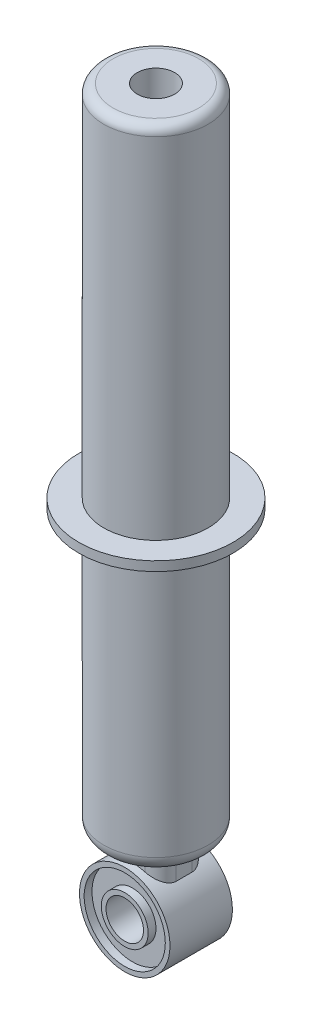
ISO-10303-21;
HEADER;
FILE_DESCRIPTION(('STEP AP214'),'2;1');
FILE_NAME('part.step','',(''),(''),'','','');
FILE_SCHEMA(('AUTOMOTIVE_DESIGN { 1 0 10303 214 1 1 1 1 }'));
ENDSEC;
DATA;
#1=APPLICATION_CONTEXT('core data for automotive mechanical design processes');
#2=APPLICATION_PROTOCOL_DEFINITION('international standard','automotive_design',2000,#1);
#3=PRODUCT_CONTEXT('',#1,'mechanical');
#4=PRODUCT('Part','Part','',(#3));
#5=PRODUCT_RELATED_PRODUCT_CATEGORY('part','',(#4));
#6=PRODUCT_DEFINITION_FORMATION('','',#4);
#7=PRODUCT_DEFINITION_CONTEXT('part definition',#1,'design');
#8=PRODUCT_DEFINITION('design','',#6,#7);
#9=PRODUCT_DEFINITION_SHAPE('','',#8);
#10=(LENGTH_UNIT() NAMED_UNIT(*) SI_UNIT(.MILLI.,.METRE.));
#11=(NAMED_UNIT(*) PLANE_ANGLE_UNIT() SI_UNIT($,.RADIAN.));
#12=(NAMED_UNIT(*) SI_UNIT($,.STERADIAN.) SOLID_ANGLE_UNIT());
#13=UNCERTAINTY_MEASURE_WITH_UNIT(LENGTH_MEASURE(1.E-05),#10,'distance_accuracy_value','');
#14=(GEOMETRIC_REPRESENTATION_CONTEXT(3) GLOBAL_UNCERTAINTY_ASSIGNED_CONTEXT((#13)) GLOBAL_UNIT_ASSIGNED_CONTEXT((#10,
#11,#12)) REPRESENTATION_CONTEXT('',''));
#15=CARTESIAN_POINT('',(0.,0.,0.));
#16=DIRECTION('',(0.,0.,1.));
#17=DIRECTION('',(1.,0.,0.));
#18=AXIS2_PLACEMENT_3D('',#15,#16,#17);
#19=CARTESIAN_POINT('',(0.,208.,0.));
#20=DIRECTION('',(0.,-1.,0.));
#21=DIRECTION('',(0.,0.,-1.));
#22=AXIS2_PLACEMENT_3D('',#19,#20,#21);
#23=CYLINDRICAL_SURFACE('',#22,16.7112299465241);
#24=CARTESIAN_POINT('',(0.,4.99999999999998,0.));
#25=DIRECTION('',(0.,1.,0.));
#26=DIRECTION('',(0.,0.,1.));
#27=AXIS2_PLACEMENT_3D('',#24,#25,#26);
#28=CIRCLE('',#27,16.7112299465241);
#29=CARTESIAN_POINT('',(0.,4.99999999999995,-16.7112299465241));
#30=VERTEX_POINT('',#29);
#31=EDGE_CURVE('E193',#30,#30,#28,.T.);
#32=CARTESIAN_POINT('',(0.,90.,0.));
#33=DIRECTION('',(0.,1.,0.));
#34=DIRECTION('',(0.,0.,1.));
#35=AXIS2_PLACEMENT_3D('',#32,#33,#34);
#36=CIRCLE('',#35,16.7112299465241);
#37=CARTESIAN_POINT('',(0.,90.,-16.7112299465241));
#38=VERTEX_POINT('',#37);
#39=EDGE_CURVE('E11',#38,#38,#36,.T.);
#40=CARTESIAN_POINT('',(0.,4.99999999999995,-16.7112299465241));
#41=CARTESIAN_POINT('',(0.,5.88541666666662,-16.7112299465241));
#42=CARTESIAN_POINT('',(0.,6.77083333333328,-16.7112299465241));
#43=CARTESIAN_POINT('',(0.,8.54166666666661,-16.7112299465241));
#44=CARTESIAN_POINT('',(0.,9.42708333333328,-16.7112299465241));
#45=CARTESIAN_POINT('',(0.,11.1979166666666,-16.7112299465241));
#46=CARTESIAN_POINT('',(0.,12.0833333333333,-16.7112299465241));
#47=CARTESIAN_POINT('',(0.,13.8541666666666,-16.7112299465241));
#48=CARTESIAN_POINT('',(0.,14.7395833333333,-16.7112299465241));
#49=CARTESIAN_POINT('',(0.,16.5104166666666,-16.7112299465241));
#50=CARTESIAN_POINT('',(0.,17.3958333333333,-16.7112299465241));
#51=CARTESIAN_POINT('',(0.,19.1666666666666,-16.7112299465241));
#52=CARTESIAN_POINT('',(0.,20.0520833333333,-16.7112299465241));
#53=CARTESIAN_POINT('',(0.,21.8229166666666,-16.7112299465241));
#54=CARTESIAN_POINT('',(0.,22.7083333333333,-16.7112299465241));
#55=CARTESIAN_POINT('',(0.,24.4791666666666,-16.7112299465241));
#56=CARTESIAN_POINT('',(0.,25.3645833333333,-16.7112299465241));
#57=CARTESIAN_POINT('',(0.,27.1354166666666,-16.7112299465241));
#58=CARTESIAN_POINT('',(0.,28.0208333333333,-16.7112299465241));
#59=CARTESIAN_POINT('',(0.,29.7916666666666,-16.7112299465241));
#60=CARTESIAN_POINT('',(0.,30.6770833333333,-16.7112299465241));
#61=CARTESIAN_POINT('',(0.,32.4479166666666,-16.7112299465241));
#62=CARTESIAN_POINT('',(0.,33.3333333333333,-16.7112299465241));
#63=CARTESIAN_POINT('',(0.,35.1041666666666,-16.7112299465241));
#64=CARTESIAN_POINT('',(0.,35.9895833333333,-16.7112299465241));
#65=CARTESIAN_POINT('',(0.,37.7604166666666,-16.7112299465241));
#66=CARTESIAN_POINT('',(0.,38.6458333333333,-16.7112299465241));
#67=CARTESIAN_POINT('',(0.,40.4166666666666,-16.7112299465241));
#68=CARTESIAN_POINT('',(0.,41.3020833333333,-16.7112299465241));
#69=CARTESIAN_POINT('',(0.,43.0729166666666,-16.7112299465241));
#70=CARTESIAN_POINT('',(0.,43.9583333333333,-16.7112299465241));
#71=CARTESIAN_POINT('',(0.,45.7291666666666,-16.7112299465241));
#72=CARTESIAN_POINT('',(0.,46.6145833333333,-16.7112299465241));
#73=CARTESIAN_POINT('',(0.,48.3854166666666,-16.7112299465241));
#74=CARTESIAN_POINT('',(0.,49.2708333333333,-16.7112299465241));
#75=CARTESIAN_POINT('',(0.,51.0416666666666,-16.7112299465241));
#76=CARTESIAN_POINT('',(0.,51.9270833333333,-16.7112299465241));
#77=CARTESIAN_POINT('',(0.,53.6979166666667,-16.7112299465241));
#78=CARTESIAN_POINT('',(0.,54.5833333333333,-16.7112299465241));
#79=CARTESIAN_POINT('',(0.,56.3541666666667,-16.7112299465241));
#80=CARTESIAN_POINT('',(0.,57.2395833333333,-16.7112299465241));
#81=CARTESIAN_POINT('',(0.,59.0104166666667,-16.7112299465241));
#82=CARTESIAN_POINT('',(0.,59.8958333333333,-16.7112299465241));
#83=CARTESIAN_POINT('',(0.,61.6666666666667,-16.7112299465241));
#84=CARTESIAN_POINT('',(0.,62.5520833333333,-16.7112299465241));
#85=CARTESIAN_POINT('',(0.,64.3229166666666,-16.7112299465241));
#86=CARTESIAN_POINT('',(0.,65.2083333333333,-16.7112299465241));
#87=CARTESIAN_POINT('',(0.,66.9791666666666,-16.7112299465241));
#88=CARTESIAN_POINT('',(0.,67.8645833333333,-16.7112299465241));
#89=CARTESIAN_POINT('',(0.,69.6354166666667,-16.7112299465241));
#90=CARTESIAN_POINT('',(0.,70.5208333333333,-16.7112299465241));
#91=CARTESIAN_POINT('',(0.,72.2916666666667,-16.7112299465241));
#92=CARTESIAN_POINT('',(0.,73.1770833333333,-16.7112299465241));
#93=CARTESIAN_POINT('',(0.,74.9479166666667,-16.7112299465241));
#94=CARTESIAN_POINT('',(0.,75.8333333333333,-16.7112299465241));
#95=CARTESIAN_POINT('',(0.,77.6041666666667,-16.7112299465241));
#96=CARTESIAN_POINT('',(0.,78.4895833333333,-16.7112299465241));
#97=CARTESIAN_POINT('',(0.,80.2604166666667,-16.7112299465241));
#98=CARTESIAN_POINT('',(0.,81.1458333333333,-16.7112299465241));
#99=CARTESIAN_POINT('',(0.,82.9166666666667,-16.7112299465241));
#100=CARTESIAN_POINT('',(0.,83.8020833333333,-16.7112299465241));
#101=CARTESIAN_POINT('',(0.,85.5729166666667,-16.7112299465241));
#102=CARTESIAN_POINT('',(0.,86.4583333333333,-16.7112299465241));
#103=CARTESIAN_POINT('',(0.,88.2291666666667,-16.7112299465241));
#104=CARTESIAN_POINT('',(0.,89.1145833333333,-16.7112299465241));
#105=CARTESIAN_POINT('',(0.,90.,-16.7112299465241));
#106=B_SPLINE_CURVE_WITH_KNOTS('',3,(#40,#41,#42,#43,#44,#45,#46,#47,#48,#49,#50,#51,#52,#53,
#54,#55,#56,#57,#58,#59,#60,#61,#62,#63,#64,#65,#66,#67,#68,#69,#70,#71,#72,#73,#74,#75,#76,#77,
#78,#79,#80,#81,#82,#83,#84,#85,#86,#87,#88,#89,#90,#91,#92,#93,#94,#95,#96,#97,#98,#99,#100,
#101,#102,#103,#104,#105),.UNSPECIFIED.,.F.,.F.,(4,2,2,2,2,2,2,2,2,2,2,2,2,2,2,2,2,2,2,2,2,2,2,
2,2,2,2,2,2,2,2,2,4),(0.,2.65625,5.3125,7.96875,10.625,13.28125,15.9375,18.59375,21.25,23.90625,
26.5625,29.21875,31.875,34.53125,37.1875,39.84375,42.5,45.15625,47.8125,50.46875,53.125,
55.78125,58.4375,61.09375,63.75,66.4062500000001,69.0625,71.7187500000001,74.375,
77.0312500000001,79.6875,82.34375,85.),.UNSPECIFIED.);
#107=EDGE_CURVE('BSEAM47',#30,#38,#106,.T.);
#108=ORIENTED_EDGE('',*,*,#31,.T.);
#109=ORIENTED_EDGE('',*,*,#39,.F.);
#110=ORIENTED_EDGE('',*,*,#107,.T.);
#111=ORIENTED_EDGE('',*,*,#107,.F.);
#112=EDGE_LOOP('',(#108,#110,#109,#111));
#113=FACE_BOUND('',#112,.T.);
#114=ADVANCED_FACE('F47',(#113),#23,.T.);
#115=CARTESIAN_POINT('',(0.,0.,0.));
#116=DIRECTION('',(0.,1.,0.));
#117=DIRECTION('',(0.,0.,1.));
#118=AXIS2_PLACEMENT_3D('',#115,#116,#117);
#119=PLANE('',#118);
#120=CARTESIAN_POINT('',(0.,0.,0.));
#121=DIRECTION('',(0.,1.,0.));
#122=DIRECTION('',(0.,0.,1.));
#123=AXIS2_PLACEMENT_3D('',#120,#121,#122);
#124=CIRCLE('',#123,11.7112299465241);
#125=CARTESIAN_POINT('',(0.,0.,11.7112299465241));
#126=VERTEX_POINT('',#125);
#127=EDGE_CURVE('E138',#126,#126,#124,.F.);
#128=ORIENTED_EDGE('',*,*,#127,.T.);
#129=EDGE_LOOP('',(#128));
#130=FACE_BOUND('',#129,.T.);
#131=DIRECTION('',(-1.,0.,0.));
#132=VECTOR('',#131,1.);
#133=CARTESIAN_POINT('',(-9.,0.,7.5));
#134=LINE('',#133,#132);
#135=CARTESIAN_POINT('',(4.,0.,7.5));
#136=VERTEX_POINT('',#135);
#137=CARTESIAN_POINT('',(-4.,0.,7.5));
#138=VERTEX_POINT('',#137);
#139=EDGE_CURVE('E136',#136,#138,#134,.T.);
#140=ORIENTED_EDGE('',*,*,#139,.F.);
#141=CARTESIAN_POINT('',(4.,0.,2.5));
#142=DIRECTION('',(0.,1.,0.));
#143=DIRECTION('',(0.,0.,1.));
#144=AXIS2_PLACEMENT_3D('',#141,#142,#143);
#145=CIRCLE('',#144,5.);
#146=CARTESIAN_POINT('',(9.,0.,2.5));
#147=VERTEX_POINT('',#146);
#148=EDGE_CURVE('E211',#136,#147,#145,.T.);
#149=ORIENTED_EDGE('',*,*,#148,.T.);
#150=DIRECTION('',(0.,0.,-1.));
#151=VECTOR('',#150,1.);
#152=CARTESIAN_POINT('',(9.,0.,7.5));
#153=LINE('',#152,#151);
#154=CARTESIAN_POINT('',(9.,0.,-2.5));
#155=VERTEX_POINT('',#154);
#156=EDGE_CURVE('E159',#147,#155,#153,.T.);
#157=ORIENTED_EDGE('',*,*,#156,.T.);
#158=CARTESIAN_POINT('',(4.,0.,-2.5));
#159=DIRECTION('',(0.,1.,0.));
#160=DIRECTION('',(0.,0.,1.));
#161=AXIS2_PLACEMENT_3D('',#158,#159,#160);
#162=CIRCLE('',#161,5.);
#163=CARTESIAN_POINT('',(4.,0.,-7.5));
#164=VERTEX_POINT('',#163);
#165=EDGE_CURVE('E93',#155,#164,#162,.T.);
#166=ORIENTED_EDGE('',*,*,#165,.T.);
#167=DIRECTION('',(-1.,0.,0.));
#168=VECTOR('',#167,1.);
#169=CARTESIAN_POINT('',(-9.,0.,-7.5));
#170=LINE('',#169,#168);
#171=CARTESIAN_POINT('',(-4.,0.,-7.5));
#172=VERTEX_POINT('',#171);
#173=EDGE_CURVE('E145',#164,#172,#170,.T.);
#174=ORIENTED_EDGE('',*,*,#173,.T.);
#175=CARTESIAN_POINT('',(-4.,0.,-2.5));
#176=DIRECTION('',(0.,1.,0.));
#177=DIRECTION('',(0.,0.,1.));
#178=AXIS2_PLACEMENT_3D('',#175,#176,#177);
#179=CIRCLE('',#178,5.);
#180=CARTESIAN_POINT('',(-9.,0.,-2.5));
#181=VERTEX_POINT('',#180);
#182=EDGE_CURVE('E63',#172,#181,#179,.T.);
#183=ORIENTED_EDGE('',*,*,#182,.T.);
#184=DIRECTION('',(0.,0.,-1.));
#185=VECTOR('',#184,1.);
#186=CARTESIAN_POINT('',(-9.,0.,7.5));
#187=LINE('',#186,#185);
#188=CARTESIAN_POINT('',(-9.,0.,2.5));
#189=VERTEX_POINT('',#188);
#190=EDGE_CURVE('E156',#189,#181,#187,.T.);
#191=ORIENTED_EDGE('',*,*,#190,.F.);
#192=CARTESIAN_POINT('',(-4.,0.,2.5));
#193=DIRECTION('',(0.,1.,0.));
#194=DIRECTION('',(0.,0.,1.));
#195=AXIS2_PLACEMENT_3D('',#192,#193,#194);
#196=CIRCLE('',#195,5.);
#197=EDGE_CURVE('E126',#189,#138,#196,.T.);
#198=ORIENTED_EDGE('',*,*,#197,.T.);
#199=EDGE_LOOP('',(#140,#149,#157,#166,#174,#183,#191,#198));
#200=FACE_BOUND('',#199,.T.);
#201=ADVANCED_FACE('F270',(#130,#200),#119,.F.);
#202=CARTESIAN_POINT('',(0.,-19.,10.));
#203=DIRECTION('',(0.,0.,-1.));
#204=DIRECTION('',(-1.,0.,0.));
#205=AXIS2_PLACEMENT_3D('',#202,#203,#204);
#206=CYLINDRICAL_SURFACE('',#205,7.5);
#207=CARTESIAN_POINT('',(0.,-19.,-10.));
#208=DIRECTION('',(0.,0.,1.));
#209=DIRECTION('',(1.,0.,0.));
#210=AXIS2_PLACEMENT_3D('',#207,#208,#209);
#211=CIRCLE('',#210,7.5);
#212=CARTESIAN_POINT('',(7.5,-19.,-10.));
#213=VERTEX_POINT('',#212);
#214=EDGE_CURVE('E179',#213,#213,#211,.T.);
#215=ORIENTED_EDGE('',*,*,#214,.T.);
#216=EDGE_LOOP('',(#215));
#217=FACE_BOUND('',#216,.T.);
#218=CARTESIAN_POINT('',(0.,-19.,-7.5));
#219=DIRECTION('',(0.,0.,1.));
#220=DIRECTION('',(1.,0.,0.));
#221=AXIS2_PLACEMENT_3D('',#218,#219,#220);
#222=CIRCLE('',#221,7.5);
#223=CARTESIAN_POINT('',(7.5,-19.,-7.5));
#224=VERTEX_POINT('',#223);
#225=EDGE_CURVE('E188',#224,#224,#222,.T.);
#226=ORIENTED_EDGE('',*,*,#225,.F.);
#227=EDGE_LOOP('',(#226));
#228=FACE_BOUND('',#227,.T.);
#229=ADVANCED_FACE('F278',(#217,#228),#206,.T.);
#230=CARTESIAN_POINT('',(0.,-19.,10.));
#231=DIRECTION('',(0.,0.,1.));
#232=DIRECTION('',(1.,0.,0.));
#233=AXIS2_PLACEMENT_3D('',#230,#231,#232);
#234=PLANE('',#233);
#235=CARTESIAN_POINT('',(0.,-19.,10.));
#236=DIRECTION('',(0.,0.,1.));
#237=DIRECTION('',(1.,0.,0.));
#238=AXIS2_PLACEMENT_3D('',#235,#236,#237);
#239=CIRCLE('',#238,7.5);
#240=CARTESIAN_POINT('',(7.5,-19.,10.));
#241=VERTEX_POINT('',#240);
#242=EDGE_CURVE('E178',#241,#241,#239,.T.);
#243=ORIENTED_EDGE('',*,*,#242,.T.);
#244=EDGE_LOOP('',(#243));
#245=FACE_BOUND('',#244,.T.);
#246=CARTESIAN_POINT('',(0.,-19.,10.));
#247=DIRECTION('',(0.,0.,1.));
#248=DIRECTION('',(1.,0.,0.));
#249=AXIS2_PLACEMENT_3D('',#246,#247,#248);
#250=CIRCLE('',#249,6.);
#251=CARTESIAN_POINT('',(6.,-19.,10.));
#252=VERTEX_POINT('',#251);
#253=EDGE_CURVE('E182',#252,#252,#250,.T.);
#254=ORIENTED_EDGE('',*,*,#253,.F.);
#255=EDGE_LOOP('',(#254));
#256=FACE_BOUND('',#255,.T.);
#257=ADVANCED_FACE('F342',(#245,#256),#234,.T.);
#258=CARTESIAN_POINT('',(0.,-19.,-10.));
#259=DIRECTION('',(0.,0.,1.));
#260=DIRECTION('',(1.,0.,0.));
#261=AXIS2_PLACEMENT_3D('',#258,#259,#260);
#262=PLANE('',#261);
#263=ORIENTED_EDGE('',*,*,#214,.F.);
#264=EDGE_LOOP('',(#263));
#265=FACE_BOUND('',#264,.T.);
#266=CARTESIAN_POINT('',(0.,-19.,-10.));
#267=DIRECTION('',(0.,0.,1.));
#268=DIRECTION('',(1.,0.,0.));
#269=AXIS2_PLACEMENT_3D('',#266,#267,#268);
#270=CIRCLE('',#269,6.);
#271=CARTESIAN_POINT('',(6.,-19.,-10.));
#272=VERTEX_POINT('',#271);
#273=EDGE_CURVE('E185',#272,#272,#270,.T.);
#274=ORIENTED_EDGE('',*,*,#273,.T.);
#275=EDGE_LOOP('',(#274));
#276=FACE_BOUND('',#275,.T.);
#277=ADVANCED_FACE('F350',(#265,#276),#262,.F.);
#278=CARTESIAN_POINT('',(0.,-19.,7.5));
#279=DIRECTION('',(0.,0.,1.));
#280=DIRECTION('',(1.,0.,0.));
#281=AXIS2_PLACEMENT_3D('',#278,#279,#280);
#282=CIRCLE('',#281,7.5);
#283=CARTESIAN_POINT('',(7.5,-19.,7.5));
#284=VERTEX_POINT('',#283);
#285=EDGE_CURVE('E172',#284,#284,#282,.T.);
#286=ORIENTED_EDGE('',*,*,#285,.T.);
#287=EDGE_LOOP('',(#286));
#288=FACE_BOUND('',#287,.T.);
#289=ORIENTED_EDGE('',*,*,#242,.F.);
#290=EDGE_LOOP('',(#289));
#291=FACE_BOUND('',#290,.T.);
#292=ADVANCED_FACE('F345',(#288,#291),#206,.T.);
#293=CARTESIAN_POINT('',(0.,-19.,10.));
#294=DIRECTION('',(0.,0.,-1.));
#295=DIRECTION('',(-1.,0.,0.));
#296=AXIS2_PLACEMENT_3D('',#293,#294,#295);
#297=CYLINDRICAL_SURFACE('',#296,6.);
#298=ORIENTED_EDGE('',*,*,#253,.T.);
#299=EDGE_LOOP('',(#298));
#300=FACE_BOUND('',#299,.T.);
#301=ORIENTED_EDGE('',*,*,#273,.F.);
#302=EDGE_LOOP('',(#301));
#303=FACE_BOUND('',#302,.T.);
#304=ADVANCED_FACE('F355',(#300,#303),#297,.F.);
#305=CARTESIAN_POINT('',(0.,-19.,7.5));
#306=DIRECTION('',(0.,0.,1.));
#307=DIRECTION('',(1.,0.,0.));
#308=AXIS2_PLACEMENT_3D('',#305,#306,#307);
#309=PLANE('',#308);
#310=CARTESIAN_POINT('',(0.,-19.,7.5));
#311=DIRECTION('',(0.,0.,1.));
#312=DIRECTION('',(1.,0.,0.));
#313=AXIS2_PLACEMENT_3D('',#310,#311,#312);
#314=CIRCLE('',#313,13.);
#315=CARTESIAN_POINT('',(13.,-19.,7.5));
#316=VERTEX_POINT('',#315);
#317=EDGE_CURVE('E169',#316,#316,#314,.T.);
#318=ORIENTED_EDGE('',*,*,#317,.T.);
#319=EDGE_LOOP('',(#318));
#320=FACE_BOUND('',#319,.T.);
#321=ORIENTED_EDGE('',*,*,#285,.F.);
#322=EDGE_LOOP('',(#321));
#323=FACE_BOUND('',#322,.T.);
#324=ADVANCED_FACE('F337',(#320,#323),#309,.T.);
#325=CARTESIAN_POINT('',(0.,-19.,-7.5));
#326=DIRECTION('',(0.,0.,1.));
#327=DIRECTION('',(1.,0.,0.));
#328=AXIS2_PLACEMENT_3D('',#325,#326,#327);
#329=PLANE('',#328);
#330=CARTESIAN_POINT('',(0.,-19.,-7.5));
#331=DIRECTION('',(0.,0.,1.));
#332=DIRECTION('',(1.,0.,0.));
#333=AXIS2_PLACEMENT_3D('',#330,#331,#332);
#334=CIRCLE('',#333,13.);
#335=CARTESIAN_POINT('',(13.,-19.,-7.5));
#336=VERTEX_POINT('',#335);
#337=EDGE_CURVE('E175',#336,#336,#334,.T.);
#338=ORIENTED_EDGE('',*,*,#337,.F.);
#339=EDGE_LOOP('',(#338));
#340=FACE_BOUND('',#339,.T.);
#341=ORIENTED_EDGE('',*,*,#225,.T.);
#342=EDGE_LOOP('',(#341));
#343=FACE_BOUND('',#342,.T.);
#344=ADVANCED_FACE('F330',(#340,#343),#329,.F.);
#345=CARTESIAN_POINT('',(0.,-19.,7.5));
#346=DIRECTION('',(0.,0.,-1.));
#347=DIRECTION('',(-1.,0.,0.));
#348=AXIS2_PLACEMENT_3D('',#345,#346,#347);
#349=CYLINDRICAL_SURFACE('',#348,13.);
#350=CARTESIAN_POINT('',(0.,-19.,-10.));
#351=DIRECTION('',(0.,0.,1.));
#352=DIRECTION('',(1.,0.,0.));
#353=AXIS2_PLACEMENT_3D('',#350,#351,#352);
#354=CIRCLE('',#353,13.);
#355=CARTESIAN_POINT('',(13.,-19.,-10.));
#356=VERTEX_POINT('',#355);
#357=EDGE_CURVE('E154',#356,#356,#354,.T.);
#358=ORIENTED_EDGE('',*,*,#357,.F.);
#359=EDGE_LOOP('',(#358));
#360=FACE_BOUND('',#359,.T.);
#361=ORIENTED_EDGE('',*,*,#337,.T.);
#362=EDGE_LOOP('',(#361));
#363=FACE_BOUND('',#362,.T.);
#364=ADVANCED_FACE('F327',(#360,#363),#349,.F.);
#365=CARTESIAN_POINT('',(0.,-19.,7.5));
#366=DIRECTION('',(0.,0.,1.));
#367=DIRECTION('',(1.,0.,0.));
#368=AXIS2_PLACEMENT_3D('',#365,#366,#367);
#369=PLANE('',#368);
#370=CARTESIAN_POINT('',(0.,-19.,7.5));
#371=DIRECTION('',(0.,0.,1.));
#372=DIRECTION('',(1.,0.,0.));
#373=AXIS2_PLACEMENT_3D('',#370,#371,#372);
#374=CIRCLE('',#373,14.5);
#375=CARTESIAN_POINT('',(-4.,-5.06264013523364,7.5));
#376=VERTEX_POINT('',#375);
#377=CARTESIAN_POINT('',(4.,-5.06264013523365,7.5));
#378=VERTEX_POINT('',#377);
#379=EDGE_CURVE('E133',#376,#378,#374,.F.);
#380=ORIENTED_EDGE('',*,*,#379,.T.);
#381=DIRECTION('',(0.,1.,0.));
#382=VECTOR('',#381,1.);
#383=CARTESIAN_POINT('',(4.,1.71774413790238E-06,7.5));
#384=LINE('',#383,#382);
#385=EDGE_CURVE('E137',#378,#136,#384,.T.);
#386=ORIENTED_EDGE('',*,*,#385,.T.);
#387=ORIENTED_EDGE('',*,*,#139,.T.);
#388=DIRECTION('',(0.,-1.,0.));
#389=VECTOR('',#388,1.);
#390=CARTESIAN_POINT('',(-4.,-7.63118299909793,7.5));
#391=LINE('',#390,#389);
#392=EDGE_CURVE('E120',#138,#376,#391,.T.);
#393=ORIENTED_EDGE('',*,*,#392,.T.);
#394=EDGE_LOOP('',(#380,#386,#387,#393));
#395=FACE_BOUND('',#394,.T.);
#396=ADVANCED_FACE('F131',(#395),#369,.T.);
#397=CARTESIAN_POINT('',(0.,-19.,-7.5));
#398=DIRECTION('',(0.,0.,1.));
#399=DIRECTION('',(1.,0.,0.));
#400=AXIS2_PLACEMENT_3D('',#397,#398,#399);
#401=PLANE('',#400);
#402=ORIENTED_EDGE('',*,*,#173,.F.);
#403=DIRECTION('',(0.,1.,0.));
#404=VECTOR('',#403,1.);
#405=CARTESIAN_POINT('',(4.,-19.,-7.5));
#406=LINE('',#405,#404);
#407=CARTESIAN_POINT('',(4.,-5.06264013523365,-7.5));
#408=VERTEX_POINT('',#407);
#409=EDGE_CURVE('E205',#164,#408,#406,.F.);
#410=ORIENTED_EDGE('',*,*,#409,.T.);
#411=CARTESIAN_POINT('',(0.,-19.,-7.5));
#412=DIRECTION('',(0.,0.,1.));
#413=DIRECTION('',(1.,0.,0.));
#414=AXIS2_PLACEMENT_3D('',#411,#412,#413);
#415=CIRCLE('',#414,14.5);
#416=CARTESIAN_POINT('',(-4.,-5.06264013523364,-7.5));
#417=VERTEX_POINT('',#416);
#418=EDGE_CURVE('E166',#417,#408,#415,.F.);
#419=ORIENTED_EDGE('',*,*,#418,.F.);
#420=DIRECTION('',(0.,-1.,0.));
#421=VECTOR('',#420,1.);
#422=CARTESIAN_POINT('',(-3.99999999999999,-19.,-7.5));
#423=LINE('',#422,#421);
#424=EDGE_CURVE('E87',#417,#172,#423,.F.);
#425=ORIENTED_EDGE('',*,*,#424,.T.);
#426=EDGE_LOOP('',(#402,#410,#419,#425));
#427=FACE_BOUND('',#426,.T.);
#428=ADVANCED_FACE('F424',(#427),#401,.F.);
#429=CARTESIAN_POINT('',(-9.,0.,7.5));
#430=DIRECTION('',(1.,0.,0.));
#431=DIRECTION('',(0.,1.,0.));
#432=AXIS2_PLACEMENT_3D('',#429,#430,#431);
#433=PLANE('',#432);
#434=ORIENTED_EDGE('',*,*,#190,.T.);
#435=DIRECTION('',(0.,-1.,0.));
#436=VECTOR('',#435,1.);
#437=CARTESIAN_POINT('',(-9.,0.,-2.5));
#438=LINE('',#437,#436);
#439=CARTESIAN_POINT('',(-9.,-7.63118299909793,-2.5));
#440=VERTEX_POINT('',#439);
#441=EDGE_CURVE('E208',#181,#440,#438,.T.);
#442=ORIENTED_EDGE('',*,*,#441,.T.);
#443=DIRECTION('',(0.,0.,-1.));
#444=VECTOR('',#443,1.);
#445=CARTESIAN_POINT('',(-9.,-7.63118299909793,7.5));
#446=LINE('',#445,#444);
#447=CARTESIAN_POINT('',(-9.,-7.63118299909793,2.5));
#448=VERTEX_POINT('',#447);
#449=EDGE_CURVE('E164',#448,#440,#446,.T.);
#450=ORIENTED_EDGE('',*,*,#449,.F.);
#451=DIRECTION('',(0.,-1.,0.));
#452=VECTOR('',#451,1.);
#453=CARTESIAN_POINT('',(-9.,1.71774413909862E-06,2.5));
#454=LINE('',#453,#452);
#455=EDGE_CURVE('E121',#448,#189,#454,.F.);
#456=ORIENTED_EDGE('',*,*,#455,.T.);
#457=EDGE_LOOP('',(#434,#442,#450,#456));
#458=FACE_BOUND('',#457,.T.);
#459=ADVANCED_FACE('F422',(#458),#433,.F.);
#460=CARTESIAN_POINT('',(9.,0.,7.5));
#461=DIRECTION('',(-1.,0.,0.));
#462=DIRECTION('',(0.,0.,1.));
#463=AXIS2_PLACEMENT_3D('',#460,#461,#462);
#464=PLANE('',#463);
#465=ORIENTED_EDGE('',*,*,#156,.F.);
#466=DIRECTION('',(0.,1.,0.));
#467=VECTOR('',#466,1.);
#468=CARTESIAN_POINT('',(9.,-7.63118299909793,2.5));
#469=LINE('',#468,#467);
#470=CARTESIAN_POINT('',(9.,-7.63118299909793,2.5));
#471=VERTEX_POINT('',#470);
#472=EDGE_CURVE('E202',#147,#471,#469,.F.);
#473=ORIENTED_EDGE('',*,*,#472,.T.);
#474=DIRECTION('',(0.,0.,-1.));
#475=VECTOR('',#474,1.);
#476=CARTESIAN_POINT('',(9.,-7.63118299909793,7.5));
#477=LINE('',#476,#475);
#478=CARTESIAN_POINT('',(9.,-7.63118299909793,-2.5));
#479=VERTEX_POINT('',#478);
#480=EDGE_CURVE('E161',#471,#479,#477,.T.);
#481=ORIENTED_EDGE('',*,*,#480,.T.);
#482=DIRECTION('',(0.,1.,0.));
#483=VECTOR('',#482,1.);
#484=CARTESIAN_POINT('',(9.,0.,-2.5));
#485=LINE('',#484,#483);
#486=EDGE_CURVE('E199',#479,#155,#485,.T.);
#487=ORIENTED_EDGE('',*,*,#486,.T.);
#488=EDGE_LOOP('',(#465,#473,#481,#487));
#489=FACE_BOUND('',#488,.T.);
#490=ADVANCED_FACE('F393',(#489),#464,.F.);
#491=CARTESIAN_POINT('',(0.,-19.,10.));
#492=DIRECTION('',(0.,0.,-1.));
#493=DIRECTION('',(-1.,0.,0.));
#494=AXIS2_PLACEMENT_3D('',#491,#492,#493);
#495=CYLINDRICAL_SURFACE('',#494,14.5);
#496=ORIENTED_EDGE('',*,*,#379,.F.);
#497=CARTESIAN_POINT('',(-4.,-5.06264013523365,7.5));
#498=CARTESIAN_POINT('',(-4.14820243259405,-5.10515011485577,7.50001381329603));
#499=CARTESIAN_POINT('',(-4.29567200790632,-5.15005520578421,7.493411997549));
#500=CARTESIAN_POINT('',(-4.58800519309362,-5.24414323684871,7.46746721414569));
#501=CARTESIAN_POINT('',(-4.73287041999179,-5.29332340352959,7.44813245422493));
#502=CARTESIAN_POINT('',(-5.01840776727717,-5.39527652565724,7.39732462275768));
#503=CARTESIAN_POINT('',(-5.15909575357869,-5.44803241464068,7.36590626916025));
#504=CARTESIAN_POINT('',(-5.4360797436884,-5.55674104076683,7.29147764910851));
#505=CARTESIAN_POINT('',(-5.57237507975263,-5.61269426039678,7.2484656294741));
#506=CARTESIAN_POINT('',(-5.97285711814035,-5.7841435560999,7.10307218891517));
#507=CARTESIAN_POINT('',(-6.22956947289004,-5.90356540233425,6.98416289144717));
#508=CARTESIAN_POINT('',(-6.71806430144488,-6.14727698582514,6.70611448217117));
#509=CARTESIAN_POINT('',(-6.94979967536824,-6.27157533723034,6.5469011968887));
#510=CARTESIAN_POINT('',(-7.40117035362807,-6.52822570601017,6.17745437727235));
#511=CARTESIAN_POINT('',(-7.61841800449484,-6.66044166226342,5.964191623823));
#512=CARTESIAN_POINT('',(-8.01331655588917,-6.91316125057603,5.49774522852705));
#513=CARTESIAN_POINT('',(-8.1910050996126,-7.03367595505221,5.24459993283805));
#514=CARTESIAN_POINT('',(-8.4640921773352,-7.22586147471534,4.76483849673911));
#515=CARTESIAN_POINT('',(-8.5690180292929,-7.30238552532421,4.54558785521481));
#516=CARTESIAN_POINT('',(-8.7470375197318,-7.43489279845252,4.0891212781076));
#517=CARTESIAN_POINT('',(-8.82022228521571,-7.49093475014322,3.85195909851345));
#518=CARTESIAN_POINT('',(-8.9164187247862,-7.56539717788131,3.42885311470055));
#519=CARTESIAN_POINT('',(-8.94755853273949,-7.58983205881398,3.24581009451842));
#520=CARTESIAN_POINT('',(-8.97891615947324,-7.61451681573892,2.96812479265945));
#521=CARTESIAN_POINT('',(-8.9868103626868,-7.62075092990863,2.87481893444955));
#522=CARTESIAN_POINT('',(-8.99735658562451,-7.6290899677004,2.68768471987493));
#523=CARTESIAN_POINT('',(-9.00000615409528,-7.63119296050286,2.59385613973379));
#524=CARTESIAN_POINT('',(-9.,-7.63118299909792,2.5));
#525=B_SPLINE_CURVE_WITH_KNOTS('',3,(#497,#498,#499,#500,#501,#502,#503,#504,#505,#506,#507,
#508,#509,#510,#511,#512,#513,#514,#515,#516,#517,#518,#519,#520,#521,#522,#523,#524),
.UNSPECIFIED.,.F.,.F.,(4,2,2,2,2,2,2,2,2,2,2,2,2,4),(0.,0.462308389641559,0.924319063714719,
1.38426179668071,1.84427412068626,2.76132531086981,3.68007662470737,4.67113519754853,
5.66124664081799,6.42279956408975,7.18215139803701,7.74213555346407,8.02345890365044,
8.30491370858578),.UNSPECIFIED.);
#526=EDGE_CURVE('E116',#376,#448,#525,.T.);
#527=ORIENTED_EDGE('',*,*,#526,.T.);
#528=ORIENTED_EDGE('',*,*,#449,.T.);
#529=CARTESIAN_POINT('',(-9.,-7.63118299909793,-2.5));
#530=CARTESIAN_POINT('',(-9.00002771176498,-7.63122271413831,-2.62286706586068));
#531=CARTESIAN_POINT('',(-8.99547215180555,-7.62759891329567,-2.74570834220573));
#532=CARTESIAN_POINT('',(-8.97741149932623,-7.61332700437687,-2.99022087630121));
#533=CARTESIAN_POINT('',(-8.96391386744255,-7.60268475203679,-3.11189302370991));
#534=CARTESIAN_POINT('',(-8.92832395773734,-7.57478633186689,-3.35222153356044));
#535=CARTESIAN_POINT('',(-8.90629914143174,-7.55758209365939,-3.4708939658293));
#536=CARTESIAN_POINT('',(-8.85402968879892,-7.51708868550429,-3.70533698052044));
#537=CARTESIAN_POINT('',(-8.82378373752524,-7.49379854215703,-3.82110709548735));
#538=CARTESIAN_POINT('',(-8.72155966455856,-7.4158838180048,-4.16222390335344));
#539=CARTESIAN_POINT('',(-8.63794674987309,-7.3530941155129,-4.38234819659285));
#540=CARTESIAN_POINT('',(-8.44330033606827,-7.21122800268964,-4.80464980192993));
#541=CARTESIAN_POINT('',(-8.33221192880008,-7.13211903244853,-5.00679006047327));
#542=CARTESIAN_POINT('',(-8.07243813682435,-6.95370701668883,-5.41192562274516));
#543=CARTESIAN_POINT('',(-7.92096148479915,-6.85313989031928,-5.61256984813347));
#544=CARTESIAN_POINT('',(-7.5920290714863,-6.64487806648673,-5.98704930509237));
#545=CARTESIAN_POINT('',(-7.41455917487673,-6.53717950846905,-6.16086984344474));
#546=CARTESIAN_POINT('',(-7.00123665187313,-6.29962380396206,-6.50983426627849));
#547=CARTESIAN_POINT('',(-6.76067035367867,-6.16938445285237,-6.67916367540906));
#548=CARTESIAN_POINT('',(-6.2516620511641,-5.91384094622706,-6.97395854258555));
#549=CARTESIAN_POINT('',(-5.9832399160252,-5.78853335975684,-7.09945499090117));
#550=CARTESIAN_POINT('',(-5.5701677973381,-5.61177617594896,-7.24919309846518));
#551=CARTESIAN_POINT('',(-5.433946989431,-5.55587971563274,-7.29211344962605));
#552=CARTESIAN_POINT('',(-5.15712463940239,-5.44728339987284,-7.36637234379613));
#553=CARTESIAN_POINT('',(-5.0165238755628,-5.39458298136806,-7.39771293184794));
#554=CARTESIAN_POINT('',(-4.73136364576615,-5.29280658199969,-7.44834665389517));
#555=CARTESIAN_POINT('',(-4.5867931236404,-5.24374251705415,-7.46760160165567));
#556=CARTESIAN_POINT('',(-4.2950594539236,-5.14986881960961,-7.49343931273461));
#557=CARTESIAN_POINT('',(-4.14789464933759,-5.1050620323044,-7.50001365729421));
#558=CARTESIAN_POINT('',(-4.,-5.06264013523365,-7.5));
#559=B_SPLINE_CURVE_WITH_KNOTS('',3,(#529,#530,#531,#532,#533,#534,#535,#536,#537,#538,#539,
#540,#541,#542,#543,#544,#545,#546,#547,#548,#549,#550,#551,#552,#553,#554,#555,#556,#557,#558),
.UNSPECIFIED.,.F.,.F.,(4,2,2,2,2,2,2,2,2,2,2,2,2,2,4),(0.,0.36842145302656,0.736535907555867,
1.10179570604134,1.46711396117586,2.19481929512306,2.9239908252313,3.73335845306785,
4.54316786663413,5.50420309132628,6.46455747413362,6.92423671201313,7.38383472945179,
7.84487769475362,8.30622664513167),.UNSPECIFIED.);
#560=EDGE_CURVE('E245',#440,#417,#559,.T.);
#561=ORIENTED_EDGE('',*,*,#560,.T.);
#562=ORIENTED_EDGE('',*,*,#418,.T.);
#563=CARTESIAN_POINT('',(4.,-5.06264013523365,-7.5));
#564=CARTESIAN_POINT('',(4.14820243259405,-5.10515011485577,-7.50001381329603));
#565=CARTESIAN_POINT('',(4.29567200790632,-5.15005520578422,-7.493411997549));
#566=CARTESIAN_POINT('',(4.58800519309362,-5.24414323684871,-7.46746721414569));
#567=CARTESIAN_POINT('',(4.73287041999179,-5.29332340352959,-7.44813245422493));
#568=CARTESIAN_POINT('',(5.01840776727717,-5.39527652565724,-7.39732462275768));
#569=CARTESIAN_POINT('',(5.15909575357869,-5.44803241464068,-7.36590626916024));
#570=CARTESIAN_POINT('',(5.4360797436884,-5.55674104076683,-7.2914776491085));
#571=CARTESIAN_POINT('',(5.57237507975263,-5.61269426039678,-7.2484656294741));
#572=CARTESIAN_POINT('',(5.97285711814035,-5.7841435560999,-7.10307218891517));
#573=CARTESIAN_POINT('',(6.22956947289004,-5.90356540233426,-6.98416289144717));
#574=CARTESIAN_POINT('',(6.71806430144489,-6.14727698582514,-6.70611448217117));
#575=CARTESIAN_POINT('',(6.94979967536824,-6.27157533723034,-6.54690119688869));
#576=CARTESIAN_POINT('',(7.40117035362808,-6.52822570601017,-6.17745437727234));
#577=CARTESIAN_POINT('',(7.61841800449485,-6.66044166226342,-5.96419162382299));
#578=CARTESIAN_POINT('',(8.01331655588918,-6.91316125057603,-5.49774522852704));
#579=CARTESIAN_POINT('',(8.1910050996126,-7.03367595505222,-5.24459993283805));
#580=CARTESIAN_POINT('',(8.4640921773352,-7.22586147471534,-4.76483849673911));
#581=CARTESIAN_POINT('',(8.5690180292929,-7.30238552532421,-4.54558785521481));
#582=CARTESIAN_POINT('',(8.7470375197318,-7.43489279845252,-4.08912127810759));
#583=CARTESIAN_POINT('',(8.82022228521572,-7.49093475014322,-3.85195909851345));
#584=CARTESIAN_POINT('',(8.9164187247862,-7.56539717788131,-3.42885311470055));
#585=CARTESIAN_POINT('',(8.94755853273949,-7.58983205881398,-3.24581009451841));
#586=CARTESIAN_POINT('',(8.97891615947325,-7.61451681573892,-2.96812479265945));
#587=CARTESIAN_POINT('',(8.9868103626868,-7.62075092990863,-2.87481893444955));
#588=CARTESIAN_POINT('',(8.99735658562452,-7.6290899677004,-2.68768471987492));
#589=CARTESIAN_POINT('',(9.00000615409528,-7.63119296050287,-2.59385613973379));
#590=CARTESIAN_POINT('',(9.,-7.63118299909793,-2.5));
#591=B_SPLINE_CURVE_WITH_KNOTS('',3,(#563,#564,#565,#566,#567,#568,#569,#570,#571,#572,#573,
#574,#575,#576,#577,#578,#579,#580,#581,#582,#583,#584,#585,#586,#587,#588,#589,#590),
.UNSPECIFIED.,.F.,.F.,(4,2,2,2,2,2,2,2,2,2,2,2,2,4),(0.,0.462308389641559,0.924319063714718,
1.38426179668071,1.84427412068626,2.7613253108698,3.68007662470737,4.67113519754853,
5.66124664081799,6.42279956408975,7.18215139803701,7.74213555346407,8.02345890365044,
8.30491370858577),.UNSPECIFIED.);
#592=EDGE_CURVE('E239',#408,#479,#591,.T.);
#593=ORIENTED_EDGE('',*,*,#592,.T.);
#594=ORIENTED_EDGE('',*,*,#480,.F.);
#595=CARTESIAN_POINT('',(9.,-7.63118299909793,2.5));
#596=CARTESIAN_POINT('',(9.00002771176498,-7.63122271413831,2.62286706586068));
#597=CARTESIAN_POINT('',(8.99547215180555,-7.62759891329567,2.74570834220573));
#598=CARTESIAN_POINT('',(8.97741149932623,-7.61332700437687,2.99022087630121));
#599=CARTESIAN_POINT('',(8.96391386744255,-7.60268475203679,3.11189302370992));
#600=CARTESIAN_POINT('',(8.92832395773734,-7.57478633186689,3.35222153356044));
#601=CARTESIAN_POINT('',(8.90629914143174,-7.55758209365939,3.4708939658293));
#602=CARTESIAN_POINT('',(8.85402968879893,-7.51708868550429,3.70533698052045));
#603=CARTESIAN_POINT('',(8.82378373752525,-7.49379854215704,3.82110709548735));
#604=CARTESIAN_POINT('',(8.72155966455856,-7.4158838180048,4.16222390335344));
#605=CARTESIAN_POINT('',(8.63794674987309,-7.35309411551291,4.38234819659285));
#606=CARTESIAN_POINT('',(8.44330033606827,-7.21122800268964,4.80464980192993));
#607=CARTESIAN_POINT('',(8.33221192880009,-7.13211903244853,5.00679006047327));
#608=CARTESIAN_POINT('',(8.07243813682435,-6.95370701668884,5.41192562274516));
#609=CARTESIAN_POINT('',(7.92096148479915,-6.85313989031928,5.61256984813347));
#610=CARTESIAN_POINT('',(7.5920290714863,-6.64487806648673,5.98704930509237));
#611=CARTESIAN_POINT('',(7.41455917487673,-6.53717950846906,6.16086984344474));
#612=CARTESIAN_POINT('',(7.00123665187313,-6.29962380396206,6.5098342662785));
#613=CARTESIAN_POINT('',(6.76067035367868,-6.16938445285237,6.67916367540906));
#614=CARTESIAN_POINT('',(6.2516620511641,-5.91384094622706,6.97395854258555));
#615=CARTESIAN_POINT('',(5.9832399160252,-5.78853335975684,7.09945499090117));
#616=CARTESIAN_POINT('',(5.5701677973381,-5.61177617594896,7.24919309846518));
#617=CARTESIAN_POINT('',(5.433946989431,-5.55587971563274,7.29211344962605));
#618=CARTESIAN_POINT('',(5.15712463940239,-5.44728339987284,7.36637234379613));
#619=CARTESIAN_POINT('',(5.0165238755628,-5.39458298136806,7.39771293184794));
#620=CARTESIAN_POINT('',(4.73136364576615,-5.29280658199969,7.44834665389517));
#621=CARTESIAN_POINT('',(4.5867931236404,-5.24374251705416,7.46760160165567));
#622=CARTESIAN_POINT('',(4.2950594539236,-5.14986881960962,7.49343931273462));
#623=CARTESIAN_POINT('',(4.14789464933759,-5.1050620323044,7.50001365729421));
#624=CARTESIAN_POINT('',(4.,-5.06264013523365,7.5));
#625=B_SPLINE_CURVE_WITH_KNOTS('',3,(#595,#596,#597,#598,#599,#600,#601,#602,#603,#604,#605,
#606,#607,#608,#609,#610,#611,#612,#613,#614,#615,#616,#617,#618,#619,#620,#621,#622,#623,#624),
.UNSPECIFIED.,.F.,.F.,(4,2,2,2,2,2,2,2,2,2,2,2,2,2,4),(0.,0.36842145302656,0.736535907555867,
1.10179570604134,1.46711396117586,2.19481929512305,2.9239908252313,3.73335845306785,
4.54316786663413,5.50420309132628,6.46455747413362,6.92423671201313,7.38383472945179,
7.84487769475363,8.30622664513167),.UNSPECIFIED.);
#626=EDGE_CURVE('E144',#471,#378,#625,.T.);
#627=ORIENTED_EDGE('',*,*,#626,.T.);
#628=EDGE_LOOP('',(#496,#527,#528,#561,#562,#593,#594,#627));
#629=FACE_BOUND('',#628,.T.);
#630=CARTESIAN_POINT('',(0.,-19.,10.));
#631=DIRECTION('',(0.,0.,1.));
#632=DIRECTION('',(1.,0.,0.));
#633=AXIS2_PLACEMENT_3D('',#630,#631,#632);
#634=CIRCLE('',#633,14.5);
#635=CARTESIAN_POINT('',(14.5,-19.,10.));
#636=VERTEX_POINT('',#635);
#637=EDGE_CURVE('E150',#636,#636,#634,.T.);
#638=ORIENTED_EDGE('',*,*,#637,.F.);
#639=EDGE_LOOP('',(#638));
#640=FACE_BOUND('',#639,.T.);
#641=CARTESIAN_POINT('',(0.,-19.,-10.));
#642=DIRECTION('',(0.,0.,1.));
#643=DIRECTION('',(1.,0.,0.));
#644=AXIS2_PLACEMENT_3D('',#641,#642,#643);
#645=CIRCLE('',#644,14.5);
#646=CARTESIAN_POINT('',(14.5,-19.,-10.));
#647=VERTEX_POINT('',#646);
#648=EDGE_CURVE('E305',#647,#647,#645,.T.);
#649=ORIENTED_EDGE('',*,*,#648,.T.);
#650=EDGE_LOOP('',(#649));
#651=FACE_BOUND('',#650,.T.);
#652=ADVANCED_FACE('F140',(#629,#640,#651),#495,.T.);
#653=CARTESIAN_POINT('',(0.,0.,10.));
#654=DIRECTION('',(0.,0.,1.));
#655=DIRECTION('',(1.,0.,0.));
#656=AXIS2_PLACEMENT_3D('',#653,#654,#655);
#657=PLANE('',#656);
#658=ORIENTED_EDGE('',*,*,#637,.T.);
#659=EDGE_LOOP('',(#658));
#660=FACE_BOUND('',#659,.T.);
#661=CARTESIAN_POINT('',(0.,-19.,10.));
#662=DIRECTION('',(0.,0.,1.));
#663=DIRECTION('',(1.,0.,0.));
#664=AXIS2_PLACEMENT_3D('',#661,#662,#663);
#665=CIRCLE('',#664,13.);
#666=CARTESIAN_POINT('',(13.,-19.,10.));
#667=VERTEX_POINT('',#666);
#668=EDGE_CURVE('E146',#667,#667,#665,.T.);
#669=ORIENTED_EDGE('',*,*,#668,.F.);
#670=EDGE_LOOP('',(#669));
#671=FACE_BOUND('',#670,.T.);
#672=ADVANCED_FACE('F384',(#660,#671),#657,.T.);
#673=CARTESIAN_POINT('',(0.,0.,-10.));
#674=DIRECTION('',(0.,0.,1.));
#675=DIRECTION('',(1.,0.,0.));
#676=AXIS2_PLACEMENT_3D('',#673,#674,#675);
#677=PLANE('',#676);
#678=ORIENTED_EDGE('',*,*,#648,.F.);
#679=EDGE_LOOP('',(#678));
#680=FACE_BOUND('',#679,.T.);
#681=ORIENTED_EDGE('',*,*,#357,.T.);
#682=EDGE_LOOP('',(#681));
#683=FACE_BOUND('',#682,.T.);
#684=ADVANCED_FACE('F325',(#680,#683),#677,.F.);
#685=ORIENTED_EDGE('',*,*,#317,.F.);
#686=EDGE_LOOP('',(#685));
#687=FACE_BOUND('',#686,.T.);
#688=ORIENTED_EDGE('',*,*,#668,.T.);
#689=EDGE_LOOP('',(#688));
#690=FACE_BOUND('',#689,.T.);
#691=ADVANCED_FACE('F332',(#687,#690),#349,.F.);
#692=CARTESIAN_POINT('',(0.,5.,0.));
#693=DIRECTION('',(0.,1.,0.));
#694=DIRECTION('',(0.,0.,1.));
#695=AXIS2_PLACEMENT_3D('',#692,#693,#694);
#696=TOROIDAL_SURFACE('',#695,11.7112299465241,5.);
#697=ORIENTED_EDGE('',*,*,#127,.F.);
#698=EDGE_LOOP('',(#697));
#699=FACE_BOUND('',#698,.T.);
#700=ORIENTED_EDGE('',*,*,#31,.F.);
#701=EDGE_LOOP('',(#700));
#702=FACE_BOUND('',#701,.T.);
#703=ADVANCED_FACE('F230',(#699,#702),#696,.T.);
#704=CARTESIAN_POINT('',(4.,-19.,2.5));
#705=DIRECTION('',(0.,-1.,0.));
#706=DIRECTION('',(0.,0.,-1.));
#707=AXIS2_PLACEMENT_3D('',#704,#705,#706);
#708=CYLINDRICAL_SURFACE('',#707,5.);
#709=ORIENTED_EDGE('',*,*,#626,.F.);
#710=ORIENTED_EDGE('',*,*,#472,.F.);
#711=ORIENTED_EDGE('',*,*,#148,.F.);
#712=ORIENTED_EDGE('',*,*,#385,.F.);
#713=EDGE_LOOP('',(#709,#710,#711,#712));
#714=FACE_BOUND('',#713,.T.);
#715=ADVANCED_FACE('F224',(#714),#708,.T.);
#716=CARTESIAN_POINT('',(4.,0.,-2.5));
#717=DIRECTION('',(0.,1.,0.));
#718=DIRECTION('',(0.,0.,1.));
#719=AXIS2_PLACEMENT_3D('',#716,#717,#718);
#720=CYLINDRICAL_SURFACE('',#719,5.);
#721=ORIENTED_EDGE('',*,*,#592,.F.);
#722=ORIENTED_EDGE('',*,*,#409,.F.);
#723=ORIENTED_EDGE('',*,*,#165,.F.);
#724=ORIENTED_EDGE('',*,*,#486,.F.);
#725=EDGE_LOOP('',(#721,#722,#723,#724));
#726=FACE_BOUND('',#725,.T.);
#727=ADVANCED_FACE('F229',(#726),#720,.T.);
#728=CARTESIAN_POINT('',(-4.,0.,-2.5));
#729=DIRECTION('',(0.,-1.,0.));
#730=DIRECTION('',(1.,0.,0.));
#731=AXIS2_PLACEMENT_3D('',#728,#729,#730);
#732=CYLINDRICAL_SURFACE('',#731,5.);
#733=ORIENTED_EDGE('',*,*,#182,.F.);
#734=ORIENTED_EDGE('',*,*,#424,.F.);
#735=ORIENTED_EDGE('',*,*,#560,.F.);
#736=ORIENTED_EDGE('',*,*,#441,.F.);
#737=EDGE_LOOP('',(#733,#734,#735,#736));
#738=FACE_BOUND('',#737,.T.);
#739=ADVANCED_FACE('F236',(#738),#732,.T.);
#740=CARTESIAN_POINT('',(-3.99999999999999,-19.,2.5));
#741=DIRECTION('',(0.,1.,0.));
#742=DIRECTION('',(-1.,0.,0.));
#743=AXIS2_PLACEMENT_3D('',#740,#741,#742);
#744=CYLINDRICAL_SURFACE('',#743,5.);
#745=ORIENTED_EDGE('',*,*,#197,.F.);
#746=ORIENTED_EDGE('',*,*,#455,.F.);
#747=ORIENTED_EDGE('',*,*,#526,.F.);
#748=ORIENTED_EDGE('',*,*,#392,.F.);
#749=EDGE_LOOP('',(#745,#746,#747,#748));
#750=FACE_BOUND('',#749,.T.);
#751=ADVANCED_FACE('F119',(#750),#744,.T.);
#752=CARTESIAN_POINT('',(0.,90.,0.));
#753=DIRECTION('',(0.,1.,0.));
#754=DIRECTION('',(0.,0.,1.));
#755=AXIS2_PLACEMENT_3D('',#752,#753,#754);
#756=CYLINDRICAL_SURFACE('',#755,24.7112299465241);
#757=CARTESIAN_POINT('',(0.,90.,0.));
#758=DIRECTION('',(0.,1.,0.));
#759=DIRECTION('',(0.,0.,1.));
#760=AXIS2_PLACEMENT_3D('',#757,#758,#759);
#761=CIRCLE('',#760,24.7112299465241);
#762=CARTESIAN_POINT('',(0.,90.,24.7112299465241));
#763=VERTEX_POINT('',#762);
#764=EDGE_CURVE('E306',#763,#763,#761,.T.);
#765=ORIENTED_EDGE('',*,*,#764,.T.);
#766=EDGE_LOOP('',(#765));
#767=FACE_BOUND('',#766,.T.);
#768=CARTESIAN_POINT('',(0.,93.,0.));
#769=DIRECTION('',(0.,1.,0.));
#770=DIRECTION('',(0.,0.,1.));
#771=AXIS2_PLACEMENT_3D('',#768,#769,#770);
#772=CIRCLE('',#771,24.7112299465241);
#773=CARTESIAN_POINT('',(0.,93.,24.7112299465241));
#774=VERTEX_POINT('',#773);
#775=EDGE_CURVE('E309',#774,#774,#772,.T.);
#776=ORIENTED_EDGE('',*,*,#775,.F.);
#777=EDGE_LOOP('',(#776));
#778=FACE_BOUND('',#777,.T.);
#779=ADVANCED_FACE('F259',(#767,#778),#756,.T.);
#780=CARTESIAN_POINT('',(0.,90.,0.));
#781=DIRECTION('',(0.,1.,0.));
#782=DIRECTION('',(0.,0.,1.));
#783=AXIS2_PLACEMENT_3D('',#780,#781,#782);
#784=PLANE('',#783);
#785=ORIENTED_EDGE('',*,*,#39,.T.);
#786=EDGE_LOOP('',(#785));
#787=FACE_BOUND('',#786,.T.);
#788=ORIENTED_EDGE('',*,*,#764,.F.);
#789=EDGE_LOOP('',(#788));
#790=FACE_BOUND('',#789,.T.);
#791=ADVANCED_FACE('F265',(#787,#790),#784,.F.);
#792=CARTESIAN_POINT('',(0.,93.,0.));
#793=DIRECTION('',(0.,1.,0.));
#794=DIRECTION('',(0.,0.,1.));
#795=AXIS2_PLACEMENT_3D('',#792,#793,#794);
#796=PLANE('',#795);
#797=CARTESIAN_POINT('',(0.,93.,0.));
#798=DIRECTION('',(0.,1.,0.));
#799=DIRECTION('',(0.,0.,1.));
#800=AXIS2_PLACEMENT_3D('',#797,#798,#799);
#801=CIRCLE('',#800,16.7112299465241);
#802=CARTESIAN_POINT('',(0.,93.,-16.7112299465241));
#803=VERTEX_POINT('',#802);
#804=EDGE_CURVE('E299',#803,#803,#801,.T.);
#805=ORIENTED_EDGE('',*,*,#804,.F.);
#806=EDGE_LOOP('',(#805));
#807=FACE_BOUND('',#806,.T.);
#808=ORIENTED_EDGE('',*,*,#775,.T.);
#809=EDGE_LOOP('',(#808));
#810=FACE_BOUND('',#809,.T.);
#811=ADVANCED_FACE('F395',(#807,#810),#796,.T.);
#812=CARTESIAN_POINT('',(0.,208.,0.));
#813=DIRECTION('',(0.,1.,0.));
#814=DIRECTION('',(0.,0.,1.));
#815=AXIS2_PLACEMENT_3D('',#812,#813,#814);
#816=PLANE('',#815);
#817=CARTESIAN_POINT('',(0.,208.,0.));
#818=DIRECTION('',(0.,1.,0.));
#819=DIRECTION('',(0.,0.,1.));
#820=AXIS2_PLACEMENT_3D('',#817,#818,#819);
#821=CIRCLE('',#820,6.);
#822=CARTESIAN_POINT('',(0.,208.,6.));
#823=VERTEX_POINT('',#822);
#824=EDGE_CURVE('E316',#823,#823,#821,.T.);
#825=ORIENTED_EDGE('',*,*,#824,.F.);
#826=EDGE_LOOP('',(#825));
#827=FACE_BOUND('',#826,.T.);
#828=CARTESIAN_POINT('',(0.,208.,0.));
#829=DIRECTION('',(0.,1.,0.));
#830=DIRECTION('',(0.,0.,1.));
#831=AXIS2_PLACEMENT_3D('',#828,#829,#830);
#832=CIRCLE('',#831,13.7112299465241);
#833=CARTESIAN_POINT('',(0.,208.,13.7112299465241));
#834=VERTEX_POINT('',#833);
#835=EDGE_CURVE('E302',#834,#834,#832,.T.);
#836=ORIENTED_EDGE('',*,*,#835,.T.);
#837=EDGE_LOOP('',(#836));
#838=FACE_BOUND('',#837,.T.);
#839=ADVANCED_FACE('F294',(#827,#838),#816,.T.);
#840=CARTESIAN_POINT('',(0.,205.,0.));
#841=DIRECTION('',(0.,1.,0.));
#842=DIRECTION('',(0.,0.,1.));
#843=AXIS2_PLACEMENT_3D('',#840,#841,#842);
#844=TOROIDAL_SURFACE('',#843,13.7112299465241,3.);
#845=CARTESIAN_POINT('',(0.,205.,0.));
#846=DIRECTION('',(0.,1.,0.));
#847=DIRECTION('',(0.,0.,1.));
#848=AXIS2_PLACEMENT_3D('',#845,#846,#847);
#849=CIRCLE('',#848,16.7112299465241);
#850=CARTESIAN_POINT('',(0.,205.,-16.7112299465241));
#851=VERTEX_POINT('',#850);
#852=EDGE_CURVE('E56',#851,#851,#849,.F.);
#853=ORIENTED_EDGE('',*,*,#852,.F.);
#854=EDGE_LOOP('',(#853));
#855=FACE_BOUND('',#854,.T.);
#856=ORIENTED_EDGE('',*,*,#835,.F.);
#857=EDGE_LOOP('',(#856));
#858=FACE_BOUND('',#857,.T.);
#859=ADVANCED_FACE('F49',(#855,#858),#844,.T.);
#860=CARTESIAN_POINT('',(0.,93.,-16.7112299465241));
#861=CARTESIAN_POINT('',(0.,94.1666666666666,-16.7112299465241));
#862=CARTESIAN_POINT('',(0.,95.3333333333333,-16.7112299465241));
#863=CARTESIAN_POINT('',(0.,97.6666666666667,-16.7112299465241));
#864=CARTESIAN_POINT('',(0.,98.8333333333333,-16.7112299465241));
#865=CARTESIAN_POINT('',(0.,101.166666666667,-16.7112299465241));
#866=CARTESIAN_POINT('',(0.,102.333333333333,-16.7112299465241));
#867=CARTESIAN_POINT('',(0.,104.666666666667,-16.7112299465241));
#868=CARTESIAN_POINT('',(0.,105.833333333333,-16.7112299465241));
#869=CARTESIAN_POINT('',(0.,108.166666666667,-16.7112299465241));
#870=CARTESIAN_POINT('',(0.,109.333333333333,-16.7112299465241));
#871=CARTESIAN_POINT('',(0.,111.666666666667,-16.7112299465241));
#872=CARTESIAN_POINT('',(0.,112.833333333333,-16.7112299465241));
#873=CARTESIAN_POINT('',(0.,115.166666666667,-16.7112299465241));
#874=CARTESIAN_POINT('',(0.,116.333333333333,-16.7112299465241));
#875=CARTESIAN_POINT('',(0.,118.666666666667,-16.7112299465241));
#876=CARTESIAN_POINT('',(0.,119.833333333333,-16.7112299465241));
#877=CARTESIAN_POINT('',(0.,122.166666666667,-16.7112299465241));
#878=CARTESIAN_POINT('',(0.,123.333333333333,-16.7112299465241));
#879=CARTESIAN_POINT('',(0.,125.666666666667,-16.7112299465241));
#880=CARTESIAN_POINT('',(0.,126.833333333333,-16.7112299465241));
#881=CARTESIAN_POINT('',(0.,129.166666666667,-16.7112299465241));
#882=CARTESIAN_POINT('',(0.,130.333333333333,-16.7112299465241));
#883=CARTESIAN_POINT('',(0.,132.666666666667,-16.7112299465241));
#884=CARTESIAN_POINT('',(0.,133.833333333333,-16.7112299465241));
#885=CARTESIAN_POINT('',(0.,136.166666666667,-16.7112299465241));
#886=CARTESIAN_POINT('',(0.,137.333333333333,-16.7112299465241));
#887=CARTESIAN_POINT('',(0.,139.666666666667,-16.7112299465241));
#888=CARTESIAN_POINT('',(0.,140.833333333333,-16.7112299465241));
#889=CARTESIAN_POINT('',(0.,143.166666666667,-16.7112299465241));
#890=CARTESIAN_POINT('',(0.,144.333333333333,-16.7112299465241));
#891=CARTESIAN_POINT('',(0.,146.666666666667,-16.7112299465241));
#892=CARTESIAN_POINT('',(0.,147.833333333333,-16.7112299465241));
#893=CARTESIAN_POINT('',(0.,150.166666666667,-16.7112299465241));
#894=CARTESIAN_POINT('',(0.,151.333333333333,-16.7112299465241));
#895=CARTESIAN_POINT('',(0.,153.666666666667,-16.7112299465241));
#896=CARTESIAN_POINT('',(0.,154.833333333333,-16.7112299465241));
#897=CARTESIAN_POINT('',(0.,157.166666666667,-16.7112299465241));
#898=CARTESIAN_POINT('',(0.,158.333333333333,-16.7112299465241));
#899=CARTESIAN_POINT('',(0.,160.666666666667,-16.7112299465241));
#900=CARTESIAN_POINT('',(0.,161.833333333333,-16.7112299465241));
#901=CARTESIAN_POINT('',(0.,164.166666666667,-16.7112299465241));
#902=CARTESIAN_POINT('',(0.,165.333333333333,-16.7112299465241));
#903=CARTESIAN_POINT('',(0.,167.666666666667,-16.7112299465241));
#904=CARTESIAN_POINT('',(0.,168.833333333333,-16.7112299465241));
#905=CARTESIAN_POINT('',(0.,171.166666666667,-16.7112299465241));
#906=CARTESIAN_POINT('',(0.,172.333333333333,-16.7112299465241));
#907=CARTESIAN_POINT('',(0.,174.666666666667,-16.7112299465241));
#908=CARTESIAN_POINT('',(0.,175.833333333333,-16.7112299465241));
#909=CARTESIAN_POINT('',(0.,178.166666666667,-16.7112299465241));
#910=CARTESIAN_POINT('',(0.,179.333333333333,-16.7112299465241));
#911=CARTESIAN_POINT('',(0.,181.666666666667,-16.7112299465241));
#912=CARTESIAN_POINT('',(0.,182.833333333333,-16.7112299465241));
#913=CARTESIAN_POINT('',(0.,185.166666666667,-16.7112299465241));
#914=CARTESIAN_POINT('',(0.,186.333333333333,-16.7112299465241));
#915=CARTESIAN_POINT('',(0.,188.666666666667,-16.7112299465241));
#916=CARTESIAN_POINT('',(0.,189.833333333333,-16.7112299465241));
#917=CARTESIAN_POINT('',(0.,192.166666666667,-16.7112299465241));
#918=CARTESIAN_POINT('',(0.,193.333333333333,-16.7112299465241));
#919=CARTESIAN_POINT('',(0.,195.666666666667,-16.7112299465241));
#920=CARTESIAN_POINT('',(0.,196.833333333333,-16.7112299465241));
#921=CARTESIAN_POINT('',(0.,199.166666666667,-16.7112299465241));
#922=CARTESIAN_POINT('',(0.,200.333333333333,-16.7112299465241));
#923=CARTESIAN_POINT('',(0.,202.666666666667,-16.7112299465241));
#924=CARTESIAN_POINT('',(0.,203.833333333333,-16.7112299465241));
#925=CARTESIAN_POINT('',(0.,205.,-16.7112299465241));
#926=B_SPLINE_CURVE_WITH_KNOTS('',3,(#860,#861,#862,#863,#864,#865,#866,#867,#868,#869,#870,
#871,#872,#873,#874,#875,#876,#877,#878,#879,#880,#881,#882,#883,#884,#885,#886,#887,#888,#889,
#890,#891,#892,#893,#894,#895,#896,#897,#898,#899,#900,#901,#902,#903,#904,#905,#906,#907,#908,
#909,#910,#911,#912,#913,#914,#915,#916,#917,#918,#919,#920,#921,#922,#923,#924,#925),
.UNSPECIFIED.,.F.,.F.,(4,2,2,2,2,2,2,2,2,2,2,2,2,2,2,2,2,2,2,2,2,2,2,2,2,2,2,2,2,2,2,2,4),(0.,
3.5,7.00000000000001,10.5,14.,17.5,21.,24.5,28.,31.5,35.,38.5,42.,45.5,49.,52.5,56.,59.5,63.,
66.5,70.,73.5,77.,80.5,84.,87.5,91.,94.5,98.,101.5,105.,108.5,112.),.UNSPECIFIED.);
#927=EDGE_CURVE('BSEAM273',#803,#851,#926,.T.);
#928=ORIENTED_EDGE('',*,*,#804,.T.);
#929=ORIENTED_EDGE('',*,*,#852,.T.);
#930=ORIENTED_EDGE('',*,*,#927,.T.);
#931=ORIENTED_EDGE('',*,*,#927,.F.);
#932=EDGE_LOOP('',(#928,#930,#929,#931));
#933=FACE_BOUND('',#932,.T.);
#934=ADVANCED_FACE('F273',(#933),#23,.T.);
#935=CARTESIAN_POINT('',(0.,128.,0.));
#936=DIRECTION('',(0.,1.,0.));
#937=DIRECTION('',(0.,0.,1.));
#938=AXIS2_PLACEMENT_3D('',#935,#936,#937);
#939=CYLINDRICAL_SURFACE('',#938,6.);
#940=CARTESIAN_POINT('',(0.,128.,0.));
#941=DIRECTION('',(0.,1.,0.));
#942=DIRECTION('',(0.,0.,1.));
#943=AXIS2_PLACEMENT_3D('',#940,#941,#942);
#944=CIRCLE('',#943,6.);
#945=CARTESIAN_POINT('',(0.,128.,6.));
#946=VERTEX_POINT('',#945);
#947=EDGE_CURVE('E313',#946,#946,#944,.T.);
#948=ORIENTED_EDGE('',*,*,#947,.F.);
#949=EDGE_LOOP('',(#948));
#950=FACE_BOUND('',#949,.T.);
#951=ORIENTED_EDGE('',*,*,#824,.T.);
#952=EDGE_LOOP('',(#951));
#953=FACE_BOUND('',#952,.T.);
#954=ADVANCED_FACE('F284',(#950,#953),#939,.F.);
#955=CARTESIAN_POINT('',(0.,128.,0.));
#956=DIRECTION('',(0.,1.,0.));
#957=DIRECTION('',(0.,0.,1.));
#958=AXIS2_PLACEMENT_3D('',#955,#956,#957);
#959=PLANE('',#958);
#960=ORIENTED_EDGE('',*,*,#947,.T.);
#961=EDGE_LOOP('',(#960));
#962=FACE_BOUND('',#961,.T.);
#963=ADVANCED_FACE('F291',(#962),#959,.T.);
#964=CLOSED_SHELL('',(#114,#201,#229,#257,#277,#292,#304,#324,#344,#364,#396,#428,#459,#490,
#652,#672,#684,#691,#703,#715,#727,#739,#751,#779,#791,#811,#839,#859,#934,#954,#963));
#965=MANIFOLD_SOLID_BREP('B2',#964);
#966=ADVANCED_BREP_SHAPE_REPRESENTATION('',(#18,#965),#14);
#967=SHAPE_DEFINITION_REPRESENTATION(#9,#966);
ENDSEC;
END-ISO-10303-21;
